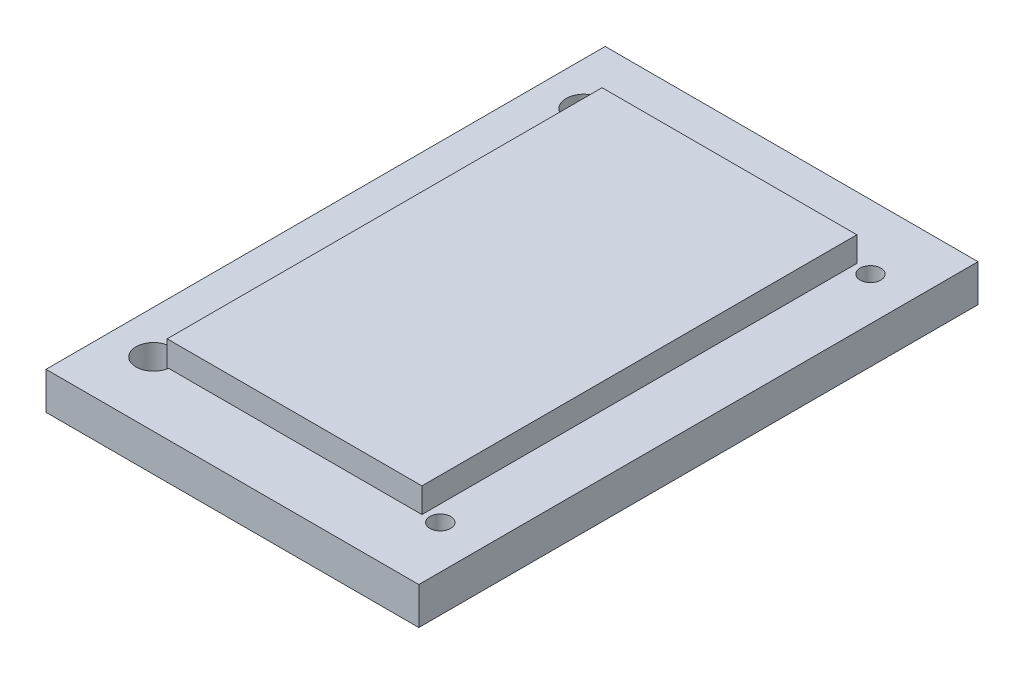
ISO-10303-21;
HEADER;
FILE_DESCRIPTION(('STEP AP214'),'2;1');
FILE_NAME('part.step','',(''),(''),'','','');
FILE_SCHEMA(('AUTOMOTIVE_DESIGN { 1 0 10303 214 1 1 1 1 }'));
ENDSEC;
DATA;
#1=APPLICATION_CONTEXT('core data for automotive mechanical design processes');
#2=APPLICATION_PROTOCOL_DEFINITION('international standard','automotive_design',2000,#1);
#3=PRODUCT_CONTEXT('',#1,'mechanical');
#4=PRODUCT('Part','Part','',(#3));
#5=PRODUCT_RELATED_PRODUCT_CATEGORY('part','',(#4));
#6=PRODUCT_DEFINITION_FORMATION('','',#4);
#7=PRODUCT_DEFINITION_CONTEXT('part definition',#1,'design');
#8=PRODUCT_DEFINITION('design','',#6,#7);
#9=PRODUCT_DEFINITION_SHAPE('','',#8);
#10=(LENGTH_UNIT() NAMED_UNIT(*) SI_UNIT(.MILLI.,.METRE.));
#11=(NAMED_UNIT(*) PLANE_ANGLE_UNIT() SI_UNIT($,.RADIAN.));
#12=(NAMED_UNIT(*) SI_UNIT($,.STERADIAN.) SOLID_ANGLE_UNIT());
#13=UNCERTAINTY_MEASURE_WITH_UNIT(LENGTH_MEASURE(1.E-05),#10,'distance_accuracy_value','');
#14=(GEOMETRIC_REPRESENTATION_CONTEXT(3) GLOBAL_UNCERTAINTY_ASSIGNED_CONTEXT((#13)) GLOBAL_UNIT_ASSIGNED_CONTEXT((#10,
#11,#12)) REPRESENTATION_CONTEXT('',''));
#15=CARTESIAN_POINT('',(0.,0.,0.));
#16=DIRECTION('',(0.,0.,1.));
#17=DIRECTION('',(1.,0.,0.));
#18=AXIS2_PLACEMENT_3D('',#15,#16,#17);
#19=CARTESIAN_POINT('',(0.,12.,0.));
#20=DIRECTION('',(0.,-1.,0.));
#21=DIRECTION('',(0.,0.,-1.));
#22=AXIS2_PLACEMENT_3D('',#19,#20,#21);
#23=PLANE('',#22);
#24=DIRECTION('',(0.,0.,-1.));
#25=VECTOR('',#24,1.);
#26=CARTESIAN_POINT('',(60.,12.,90.));
#27=LINE('',#26,#25);
#28=CARTESIAN_POINT('',(60.,12.,90.));
#29=VERTEX_POINT('',#28);
#30=CARTESIAN_POINT('',(60.,12.,-90.));
#31=VERTEX_POINT('',#30);
#32=EDGE_CURVE('E203',#29,#31,#27,.T.);
#33=ORIENTED_EDGE('',*,*,#32,.T.);
#34=DIRECTION('',(-1.,0.,0.));
#35=VECTOR('',#34,1.);
#36=CARTESIAN_POINT('',(-60.,12.,-90.));
#37=LINE('',#36,#35);
#38=CARTESIAN_POINT('',(-60.,12.,-90.));
#39=VERTEX_POINT('',#38);
#40=EDGE_CURVE('E92',#31,#39,#37,.T.);
#41=ORIENTED_EDGE('',*,*,#40,.T.);
#42=DIRECTION('',(0.,0.,1.));
#43=VECTOR('',#42,1.);
#44=CARTESIAN_POINT('',(-60.,12.,90.));
#45=LINE('',#44,#43);
#46=CARTESIAN_POINT('',(-60.,12.,90.));
#47=VERTEX_POINT('',#46);
#48=EDGE_CURVE('E206',#39,#47,#45,.T.);
#49=ORIENTED_EDGE('',*,*,#48,.T.);
#50=DIRECTION('',(1.,0.,0.));
#51=VECTOR('',#50,1.);
#52=CARTESIAN_POINT('',(-60.,12.,90.));
#53=LINE('',#52,#51);
#54=EDGE_CURVE('E63',#47,#29,#53,.T.);
#55=ORIENTED_EDGE('',*,*,#54,.T.);
#56=EDGE_LOOP('',(#33,#41,#49,#55));
#57=FACE_BOUND('',#56,.T.);
#58=CARTESIAN_POINT('',(46.1538461538462,12.,69.2307692307693));
#59=DIRECTION('',(0.,1.,0.));
#60=DIRECTION('',(0.,0.,1.));
#61=AXIS2_PLACEMENT_3D('',#58,#59,#60);
#62=CIRCLE('',#61,3.34615384615381);
#63=CARTESIAN_POINT('',(46.1538461538462,12.,72.5769230769231));
#64=VERTEX_POINT('',#63);
#65=EDGE_CURVE('E191',#64,#64,#62,.T.);
#66=ORIENTED_EDGE('',*,*,#65,.F.);
#67=EDGE_LOOP('',(#66));
#68=FACE_BOUND('',#67,.T.);
#69=CARTESIAN_POINT('',(46.1538461538462,12.,-69.2307692307692));
#70=DIRECTION('',(0.,1.,0.));
#71=DIRECTION('',(0.,0.,1.));
#72=AXIS2_PLACEMENT_3D('',#69,#70,#71);
#73=CIRCLE('',#72,3.34615384615381);
#74=CARTESIAN_POINT('',(46.1538461538462,12.,-65.8846153846154));
#75=VERTEX_POINT('',#74);
#76=EDGE_CURVE('E180',#75,#75,#73,.T.);
#77=ORIENTED_EDGE('',*,*,#76,.F.);
#78=EDGE_LOOP('',(#77));
#79=FACE_BOUND('',#78,.T.);
#80=DIRECTION('',(0.,0.,1.));
#81=VECTOR('',#80,1.);
#82=CARTESIAN_POINT('',(-41.,12.,0.));
#83=LINE('',#82,#81);
#84=CARTESIAN_POINT('',(-41.,12.,-66.9061518098059));
#85=VERTEX_POINT('',#84);
#86=CARTESIAN_POINT('',(-41.,12.,66.9061518098059));
#87=VERTEX_POINT('',#86);
#88=EDGE_CURVE('E164',#85,#87,#83,.T.);
#89=ORIENTED_EDGE('',*,*,#88,.F.);
#90=CARTESIAN_POINT('',(-46.1538461538462,12.,-69.2307692307692));
#91=DIRECTION('',(0.,1.,0.));
#92=DIRECTION('',(0.,0.,1.));
#93=AXIS2_PLACEMENT_3D('',#90,#91,#92);
#94=CIRCLE('',#93,5.65384615384616);
#95=CARTESIAN_POINT('',(-40.5525730525745,12.,-70.));
#96=VERTEX_POINT('',#95);
#97=EDGE_CURVE('E186',#96,#85,#94,.T.);
#98=ORIENTED_EDGE('',*,*,#97,.F.);
#99=DIRECTION('',(-1.,0.,0.));
#100=VECTOR('',#99,1.);
#101=CARTESIAN_POINT('',(0.,12.,-70.));
#102=LINE('',#101,#100);
#103=CARTESIAN_POINT('',(41.,12.,-70.));
#104=VERTEX_POINT('',#103);
#105=EDGE_CURVE('E174',#104,#96,#102,.T.);
#106=ORIENTED_EDGE('',*,*,#105,.F.);
#107=DIRECTION('',(0.,0.,-1.));
#108=VECTOR('',#107,1.);
#109=CARTESIAN_POINT('',(41.,12.,0.));
#110=LINE('',#109,#108);
#111=CARTESIAN_POINT('',(41.,12.,70.));
#112=VERTEX_POINT('',#111);
#113=EDGE_CURVE('E163',#112,#104,#110,.T.);
#114=ORIENTED_EDGE('',*,*,#113,.F.);
#115=DIRECTION('',(1.,0.,0.));
#116=VECTOR('',#115,1.);
#117=CARTESIAN_POINT('',(0.,12.,70.));
#118=LINE('',#117,#116);
#119=CARTESIAN_POINT('',(-40.5525730525745,12.,70.));
#120=VERTEX_POINT('',#119);
#121=EDGE_CURVE('E176',#120,#112,#118,.T.);
#122=ORIENTED_EDGE('',*,*,#121,.F.);
#123=CARTESIAN_POINT('',(-46.1538461538462,12.,69.2307692307692));
#124=DIRECTION('',(0.,1.,0.));
#125=DIRECTION('',(0.,0.,1.));
#126=AXIS2_PLACEMENT_3D('',#123,#124,#125);
#127=CIRCLE('',#126,5.65384615384616);
#128=EDGE_CURVE('E197',#87,#120,#127,.T.);
#129=ORIENTED_EDGE('',*,*,#128,.F.);
#130=EDGE_LOOP('',(#89,#98,#106,#114,#122,#129));
#131=FACE_BOUND('',#130,.T.);
#132=ADVANCED_FACE('F39',(#57,#68,#79,#131),#23,.F.);
#133=CARTESIAN_POINT('',(-46.1538461538462,12.,69.2307692307692));
#134=DIRECTION('',(0.,-1.,0.));
#135=DIRECTION('',(0.,0.,-1.));
#136=AXIS2_PLACEMENT_3D('',#133,#134,#135);
#137=CYLINDRICAL_SURFACE('',#136,5.65384615384616);
#138=CARTESIAN_POINT('',(-46.1538461538462,0.,69.2307692307692));
#139=DIRECTION('',(0.,1.,0.));
#140=DIRECTION('',(0.,0.,1.));
#141=AXIS2_PLACEMENT_3D('',#138,#139,#140);
#142=CIRCLE('',#141,5.65384615384616);
#143=CARTESIAN_POINT('',(-41.,0.,66.9061518098059));
#144=VERTEX_POINT('',#143);
#145=CARTESIAN_POINT('',(-40.5525730525745,0.,70.));
#146=VERTEX_POINT('',#145);
#147=EDGE_CURVE('E194',#144,#146,#142,.T.);
#148=ORIENTED_EDGE('',*,*,#147,.F.);
#149=DIRECTION('',(0.,-1.,0.));
#150=VECTOR('',#149,1.);
#151=CARTESIAN_POINT('',(-41.,12.,66.9061518098059));
#152=LINE('',#151,#150);
#153=EDGE_CURVE('E166',#144,#87,#152,.F.);
#154=ORIENTED_EDGE('',*,*,#153,.T.);
#155=ORIENTED_EDGE('',*,*,#128,.T.);
#156=DIRECTION('',(0.,-1.,0.));
#157=VECTOR('',#156,1.);
#158=CARTESIAN_POINT('',(-40.5525730525745,12.,70.));
#159=LINE('',#158,#157);
#160=EDGE_CURVE('E11',#120,#146,#159,.T.);
#161=ORIENTED_EDGE('',*,*,#160,.T.);
#162=EDGE_LOOP('',(#148,#154,#155,#161));
#163=FACE_BOUND('',#162,.T.);
#164=ADVANCED_FACE('F241',(#163),#137,.F.);
#165=CARTESIAN_POINT('',(-46.1538461538462,12.,-69.2307692307692));
#166=DIRECTION('',(0.,-1.,0.));
#167=DIRECTION('',(0.,0.,-1.));
#168=AXIS2_PLACEMENT_3D('',#165,#166,#167);
#169=CYLINDRICAL_SURFACE('',#168,5.65384615384616);
#170=CARTESIAN_POINT('',(-46.1538461538462,0.,-69.2307692307692));
#171=DIRECTION('',(0.,1.,0.));
#172=DIRECTION('',(0.,0.,1.));
#173=AXIS2_PLACEMENT_3D('',#170,#171,#172);
#174=CIRCLE('',#173,5.65384615384616);
#175=CARTESIAN_POINT('',(-40.5525730525745,0.,-70.));
#176=VERTEX_POINT('',#175);
#177=CARTESIAN_POINT('',(-41.,0.,-66.9061518098059));
#178=VERTEX_POINT('',#177);
#179=EDGE_CURVE('E183',#176,#178,#174,.T.);
#180=ORIENTED_EDGE('',*,*,#179,.F.);
#181=DIRECTION('',(0.,-1.,0.));
#182=VECTOR('',#181,1.);
#183=CARTESIAN_POINT('',(-40.5525730525745,12.,-70.));
#184=LINE('',#183,#182);
#185=EDGE_CURVE('E47',#176,#96,#184,.F.);
#186=ORIENTED_EDGE('',*,*,#185,.T.);
#187=ORIENTED_EDGE('',*,*,#97,.T.);
#188=DIRECTION('',(0.,-1.,0.));
#189=VECTOR('',#188,1.);
#190=CARTESIAN_POINT('',(-41.,12.,-66.9061518098059));
#191=LINE('',#190,#189);
#192=EDGE_CURVE('E225',#85,#178,#191,.T.);
#193=ORIENTED_EDGE('',*,*,#192,.T.);
#194=EDGE_LOOP('',(#180,#186,#187,#193));
#195=FACE_BOUND('',#194,.T.);
#196=ADVANCED_FACE('F231',(#195),#169,.F.);
#197=CARTESIAN_POINT('',(0.,0.,0.));
#198=DIRECTION('',(0.,-1.,0.));
#199=DIRECTION('',(0.,0.,-1.));
#200=AXIS2_PLACEMENT_3D('',#197,#198,#199);
#201=PLANE('',#200);
#202=DIRECTION('',(-1.,0.,0.));
#203=VECTOR('',#202,1.);
#204=CARTESIAN_POINT('',(-41.,0.,-70.));
#205=LINE('',#204,#203);
#206=CARTESIAN_POINT('',(-41.,0.,-70.));
#207=VERTEX_POINT('',#206);
#208=EDGE_CURVE('E54',#176,#207,#205,.T.);
#209=ORIENTED_EDGE('',*,*,#208,.F.);
#210=ORIENTED_EDGE('',*,*,#179,.T.);
#211=DIRECTION('',(0.,0.,1.));
#212=VECTOR('',#211,1.);
#213=CARTESIAN_POINT('',(-41.,0.,70.));
#214=LINE('',#213,#212);
#215=EDGE_CURVE('E249',#207,#178,#214,.T.);
#216=ORIENTED_EDGE('',*,*,#215,.F.);
#217=EDGE_LOOP('',(#209,#210,#216));
#218=FACE_BOUND('',#217,.T.);
#219=CARTESIAN_POINT('',(-41.,0.,70.));
#220=VERTEX_POINT('',#219);
#221=EDGE_CURVE('E246',#144,#220,#214,.T.);
#222=ORIENTED_EDGE('',*,*,#221,.F.);
#223=ORIENTED_EDGE('',*,*,#147,.T.);
#224=DIRECTION('',(1.,0.,0.));
#225=VECTOR('',#224,1.);
#226=CARTESIAN_POINT('',(-41.,0.,70.));
#227=LINE('',#226,#225);
#228=EDGE_CURVE('E159',#220,#146,#227,.T.);
#229=ORIENTED_EDGE('',*,*,#228,.F.);
#230=EDGE_LOOP('',(#222,#223,#229));
#231=FACE_BOUND('',#230,.T.);
#232=CARTESIAN_POINT('',(46.1538461538462,0.,-69.2307692307692));
#233=DIRECTION('',(0.,1.,0.));
#234=DIRECTION('',(0.,0.,1.));
#235=AXIS2_PLACEMENT_3D('',#232,#233,#234);
#236=CIRCLE('',#235,3.34615384615381);
#237=CARTESIAN_POINT('',(46.1538461538462,0.,-65.8846153846154));
#238=VERTEX_POINT('',#237);
#239=EDGE_CURVE('E179',#238,#238,#236,.T.);
#240=ORIENTED_EDGE('',*,*,#239,.T.);
#241=EDGE_LOOP('',(#240));
#242=FACE_BOUND('',#241,.T.);
#243=CARTESIAN_POINT('',(46.1538461538462,0.,69.2307692307693));
#244=DIRECTION('',(0.,1.,0.));
#245=DIRECTION('',(0.,0.,1.));
#246=AXIS2_PLACEMENT_3D('',#243,#244,#245);
#247=CIRCLE('',#246,3.34615384615381);
#248=CARTESIAN_POINT('',(46.1538461538462,0.,72.5769230769231));
#249=VERTEX_POINT('',#248);
#250=EDGE_CURVE('E189',#249,#249,#247,.T.);
#251=ORIENTED_EDGE('',*,*,#250,.T.);
#252=EDGE_LOOP('',(#251));
#253=FACE_BOUND('',#252,.T.);
#254=DIRECTION('',(0.,0.,-1.));
#255=VECTOR('',#254,1.);
#256=CARTESIAN_POINT('',(60.,0.,90.));
#257=LINE('',#256,#255);
#258=CARTESIAN_POINT('',(60.,0.,90.));
#259=VERTEX_POINT('',#258);
#260=CARTESIAN_POINT('',(60.,0.,-90.));
#261=VERTEX_POINT('',#260);
#262=EDGE_CURVE('E200',#259,#261,#257,.T.);
#263=ORIENTED_EDGE('',*,*,#262,.F.);
#264=DIRECTION('',(1.,0.,0.));
#265=VECTOR('',#264,1.);
#266=CARTESIAN_POINT('',(-60.,0.,90.));
#267=LINE('',#266,#265);
#268=CARTESIAN_POINT('',(-60.,0.,90.));
#269=VERTEX_POINT('',#268);
#270=EDGE_CURVE('E84',#269,#259,#267,.T.);
#271=ORIENTED_EDGE('',*,*,#270,.F.);
#272=DIRECTION('',(0.,0.,1.));
#273=VECTOR('',#272,1.);
#274=CARTESIAN_POINT('',(-60.,0.,90.));
#275=LINE('',#274,#273);
#276=CARTESIAN_POINT('',(-60.,0.,-90.));
#277=VERTEX_POINT('',#276);
#278=EDGE_CURVE('E214',#277,#269,#275,.T.);
#279=ORIENTED_EDGE('',*,*,#278,.F.);
#280=DIRECTION('',(-1.,0.,0.));
#281=VECTOR('',#280,1.);
#282=CARTESIAN_POINT('',(-60.,0.,-90.));
#283=LINE('',#282,#281);
#284=EDGE_CURVE('E212',#261,#277,#283,.T.);
#285=ORIENTED_EDGE('',*,*,#284,.F.);
#286=EDGE_LOOP('',(#263,#271,#279,#285));
#287=FACE_BOUND('',#286,.T.);
#288=ADVANCED_FACE('F244',(#218,#231,#242,#253,#287),#201,.T.);
#289=CARTESIAN_POINT('',(60.,12.,90.));
#290=DIRECTION('',(-1.,0.,0.));
#291=DIRECTION('',(0.,0.,1.));
#292=AXIS2_PLACEMENT_3D('',#289,#290,#291);
#293=PLANE('',#292);
#294=ORIENTED_EDGE('',*,*,#262,.T.);
#295=DIRECTION('',(0.,-1.,0.));
#296=VECTOR('',#295,1.);
#297=CARTESIAN_POINT('',(60.,12.,-90.));
#298=LINE('',#297,#296);
#299=EDGE_CURVE('E223',#31,#261,#298,.T.);
#300=ORIENTED_EDGE('',*,*,#299,.F.);
#301=ORIENTED_EDGE('',*,*,#32,.F.);
#302=DIRECTION('',(0.,-1.,0.));
#303=VECTOR('',#302,1.);
#304=CARTESIAN_POINT('',(60.,12.,90.));
#305=LINE('',#304,#303);
#306=EDGE_CURVE('E209',#29,#259,#305,.T.);
#307=ORIENTED_EDGE('',*,*,#306,.T.);
#308=EDGE_LOOP('',(#294,#300,#301,#307));
#309=FACE_BOUND('',#308,.T.);
#310=ADVANCED_FACE('F41',(#309),#293,.F.);
#311=CARTESIAN_POINT('',(-60.,12.,-90.));
#312=DIRECTION('',(0.,0.,1.));
#313=DIRECTION('',(1.,0.,0.));
#314=AXIS2_PLACEMENT_3D('',#311,#312,#313);
#315=PLANE('',#314);
#316=ORIENTED_EDGE('',*,*,#284,.T.);
#317=DIRECTION('',(0.,-1.,0.));
#318=VECTOR('',#317,1.);
#319=CARTESIAN_POINT('',(-60.,12.,-90.));
#320=LINE('',#319,#318);
#321=EDGE_CURVE('E220',#39,#277,#320,.T.);
#322=ORIENTED_EDGE('',*,*,#321,.F.);
#323=ORIENTED_EDGE('',*,*,#40,.F.);
#324=ORIENTED_EDGE('',*,*,#299,.T.);
#325=EDGE_LOOP('',(#316,#322,#323,#324));
#326=FACE_BOUND('',#325,.T.);
#327=ADVANCED_FACE('F265',(#326),#315,.F.);
#328=CARTESIAN_POINT('',(-60.,12.,90.));
#329=DIRECTION('',(1.,0.,0.));
#330=DIRECTION('',(0.,0.,-1.));
#331=AXIS2_PLACEMENT_3D('',#328,#329,#330);
#332=PLANE('',#331);
#333=ORIENTED_EDGE('',*,*,#278,.T.);
#334=DIRECTION('',(0.,-1.,0.));
#335=VECTOR('',#334,1.);
#336=CARTESIAN_POINT('',(-60.,12.,90.));
#337=LINE('',#336,#335);
#338=EDGE_CURVE('E218',#47,#269,#337,.T.);
#339=ORIENTED_EDGE('',*,*,#338,.F.);
#340=ORIENTED_EDGE('',*,*,#48,.F.);
#341=ORIENTED_EDGE('',*,*,#321,.T.);
#342=EDGE_LOOP('',(#333,#339,#340,#341));
#343=FACE_BOUND('',#342,.T.);
#344=ADVANCED_FACE('F327',(#343),#332,.F.);
#345=CARTESIAN_POINT('',(-60.,12.,90.));
#346=DIRECTION('',(0.,0.,-1.));
#347=DIRECTION('',(-1.,0.,0.));
#348=AXIS2_PLACEMENT_3D('',#345,#346,#347);
#349=PLANE('',#348);
#350=ORIENTED_EDGE('',*,*,#270,.T.);
#351=ORIENTED_EDGE('',*,*,#306,.F.);
#352=ORIENTED_EDGE('',*,*,#54,.F.);
#353=ORIENTED_EDGE('',*,*,#338,.T.);
#354=EDGE_LOOP('',(#350,#351,#352,#353));
#355=FACE_BOUND('',#354,.T.);
#356=ADVANCED_FACE('F280',(#355),#349,.F.);
#357=CARTESIAN_POINT('',(46.1538461538462,12.,69.2307692307693));
#358=DIRECTION('',(0.,-1.,0.));
#359=DIRECTION('',(0.,0.,-1.));
#360=AXIS2_PLACEMENT_3D('',#357,#358,#359);
#361=CYLINDRICAL_SURFACE('',#360,3.34615384615381);
#362=ORIENTED_EDGE('',*,*,#65,.T.);
#363=EDGE_LOOP('',(#362));
#364=FACE_BOUND('',#363,.T.);
#365=ORIENTED_EDGE('',*,*,#250,.F.);
#366=EDGE_LOOP('',(#365));
#367=FACE_BOUND('',#366,.T.);
#368=ADVANCED_FACE('F277',(#364,#367),#361,.F.);
#369=CARTESIAN_POINT('',(46.1538461538462,12.,-69.2307692307692));
#370=DIRECTION('',(0.,-1.,0.));
#371=DIRECTION('',(0.,0.,-1.));
#372=AXIS2_PLACEMENT_3D('',#369,#370,#371);
#373=CYLINDRICAL_SURFACE('',#372,3.34615384615381);
#374=ORIENTED_EDGE('',*,*,#76,.T.);
#375=EDGE_LOOP('',(#374));
#376=FACE_BOUND('',#375,.T.);
#377=ORIENTED_EDGE('',*,*,#239,.F.);
#378=EDGE_LOOP('',(#377));
#379=FACE_BOUND('',#378,.T.);
#380=ADVANCED_FACE('F279',(#376,#379),#373,.F.);
#381=CARTESIAN_POINT('',(41.,20.,70.));
#382=DIRECTION('',(-1.,0.,0.));
#383=DIRECTION('',(0.,0.,1.));
#384=AXIS2_PLACEMENT_3D('',#381,#382,#383);
#385=PLANE('',#384);
#386=DIRECTION('',(0.,-1.,0.));
#387=VECTOR('',#386,1.);
#388=CARTESIAN_POINT('',(41.,20.,70.));
#389=LINE('',#388,#387);
#390=CARTESIAN_POINT('',(41.,20.,70.));
#391=VERTEX_POINT('',#390);
#392=EDGE_CURVE('E255',#391,#112,#389,.T.);
#393=ORIENTED_EDGE('',*,*,#392,.T.);
#394=ORIENTED_EDGE('',*,*,#113,.T.);
#395=DIRECTION('',(0.,-1.,0.));
#396=VECTOR('',#395,1.);
#397=CARTESIAN_POINT('',(41.,20.,-70.));
#398=LINE('',#397,#396);
#399=CARTESIAN_POINT('',(41.,20.,-70.));
#400=VERTEX_POINT('',#399);
#401=EDGE_CURVE('E143',#400,#104,#398,.T.);
#402=ORIENTED_EDGE('',*,*,#401,.F.);
#403=DIRECTION('',(0.,0.,-1.));
#404=VECTOR('',#403,1.);
#405=CARTESIAN_POINT('',(41.,20.,70.));
#406=LINE('',#405,#404);
#407=EDGE_CURVE('E150',#391,#400,#406,.T.);
#408=ORIENTED_EDGE('',*,*,#407,.F.);
#409=EDGE_LOOP('',(#393,#394,#402,#408));
#410=FACE_BOUND('',#409,.T.);
#411=ADVANCED_FACE('F161',(#410),#385,.F.);
#412=CARTESIAN_POINT('',(-41.,20.,70.));
#413=DIRECTION('',(0.,0.,-1.));
#414=DIRECTION('',(-1.,0.,0.));
#415=AXIS2_PLACEMENT_3D('',#412,#413,#414);
#416=PLANE('',#415);
#417=ORIENTED_EDGE('',*,*,#160,.F.);
#418=ORIENTED_EDGE('',*,*,#121,.T.);
#419=ORIENTED_EDGE('',*,*,#392,.F.);
#420=DIRECTION('',(1.,0.,0.));
#421=VECTOR('',#420,1.);
#422=CARTESIAN_POINT('',(-41.,20.,70.));
#423=LINE('',#422,#421);
#424=CARTESIAN_POINT('',(-41.,20.,70.));
#425=VERTEX_POINT('',#424);
#426=EDGE_CURVE('E155',#425,#391,#423,.T.);
#427=ORIENTED_EDGE('',*,*,#426,.F.);
#428=DIRECTION('',(0.,-1.,0.));
#429=VECTOR('',#428,1.);
#430=CARTESIAN_POINT('',(-41.,20.,70.));
#431=LINE('',#430,#429);
#432=EDGE_CURVE('E168',#425,#220,#431,.T.);
#433=ORIENTED_EDGE('',*,*,#432,.T.);
#434=ORIENTED_EDGE('',*,*,#228,.T.);
#435=EDGE_LOOP('',(#417,#418,#419,#427,#433,#434));
#436=FACE_BOUND('',#435,.T.);
#437=ADVANCED_FACE('F257',(#436),#416,.F.);
#438=CARTESIAN_POINT('',(-41.,20.,-70.));
#439=DIRECTION('',(0.,0.,1.));
#440=DIRECTION('',(1.,0.,0.));
#441=AXIS2_PLACEMENT_3D('',#438,#439,#440);
#442=PLANE('',#441);
#443=ORIENTED_EDGE('',*,*,#401,.T.);
#444=ORIENTED_EDGE('',*,*,#105,.T.);
#445=ORIENTED_EDGE('',*,*,#185,.F.);
#446=ORIENTED_EDGE('',*,*,#208,.T.);
#447=DIRECTION('',(0.,-1.,0.));
#448=VECTOR('',#447,1.);
#449=CARTESIAN_POINT('',(-41.,20.,-70.));
#450=LINE('',#449,#448);
#451=CARTESIAN_POINT('',(-41.,20.,-70.));
#452=VERTEX_POINT('',#451);
#453=EDGE_CURVE('E146',#452,#207,#450,.T.);
#454=ORIENTED_EDGE('',*,*,#453,.F.);
#455=DIRECTION('',(-1.,0.,0.));
#456=VECTOR('',#455,1.);
#457=CARTESIAN_POINT('',(-41.,20.,-70.));
#458=LINE('',#457,#456);
#459=EDGE_CURVE('E139',#400,#452,#458,.T.);
#460=ORIENTED_EDGE('',*,*,#459,.F.);
#461=EDGE_LOOP('',(#443,#444,#445,#446,#454,#460));
#462=FACE_BOUND('',#461,.T.);
#463=ADVANCED_FACE('F141',(#462),#442,.F.);
#464=CARTESIAN_POINT('',(-41.,20.,70.));
#465=DIRECTION('',(1.,0.,0.));
#466=DIRECTION('',(0.,0.,-1.));
#467=AXIS2_PLACEMENT_3D('',#464,#465,#466);
#468=PLANE('',#467);
#469=ORIENTED_EDGE('',*,*,#153,.F.);
#470=ORIENTED_EDGE('',*,*,#221,.T.);
#471=ORIENTED_EDGE('',*,*,#432,.F.);
#472=DIRECTION('',(0.,0.,1.));
#473=VECTOR('',#472,1.);
#474=CARTESIAN_POINT('',(-41.,20.,70.));
#475=LINE('',#474,#473);
#476=EDGE_CURVE('E149',#452,#425,#475,.T.);
#477=ORIENTED_EDGE('',*,*,#476,.F.);
#478=ORIENTED_EDGE('',*,*,#453,.T.);
#479=ORIENTED_EDGE('',*,*,#215,.T.);
#480=ORIENTED_EDGE('',*,*,#192,.F.);
#481=ORIENTED_EDGE('',*,*,#88,.T.);
#482=EDGE_LOOP('',(#469,#470,#471,#477,#478,#479,#480,#481));
#483=FACE_BOUND('',#482,.T.);
#484=ADVANCED_FACE('F237',(#483),#468,.F.);
#485=CARTESIAN_POINT('',(0.,20.,0.));
#486=DIRECTION('',(0.,-1.,0.));
#487=DIRECTION('',(0.,0.,-1.));
#488=AXIS2_PLACEMENT_3D('',#485,#486,#487);
#489=PLANE('',#488);
#490=ORIENTED_EDGE('',*,*,#407,.T.);
#491=ORIENTED_EDGE('',*,*,#459,.T.);
#492=ORIENTED_EDGE('',*,*,#476,.T.);
#493=ORIENTED_EDGE('',*,*,#426,.T.);
#494=EDGE_LOOP('',(#490,#491,#492,#493));
#495=FACE_BOUND('',#494,.T.);
#496=ADVANCED_FACE('F153',(#495),#489,.F.);
#497=CLOSED_SHELL('',(#132,#164,#196,#288,#310,#327,#344,#356,#368,#380,#411,#437,#463,#484,#496));
#498=MANIFOLD_SOLID_BREP('B2',#497);
#499=ADVANCED_BREP_SHAPE_REPRESENTATION('',(#18,#498),#14);
#500=SHAPE_DEFINITION_REPRESENTATION(#9,#499);
ENDSEC;
END-ISO-10303-21;
